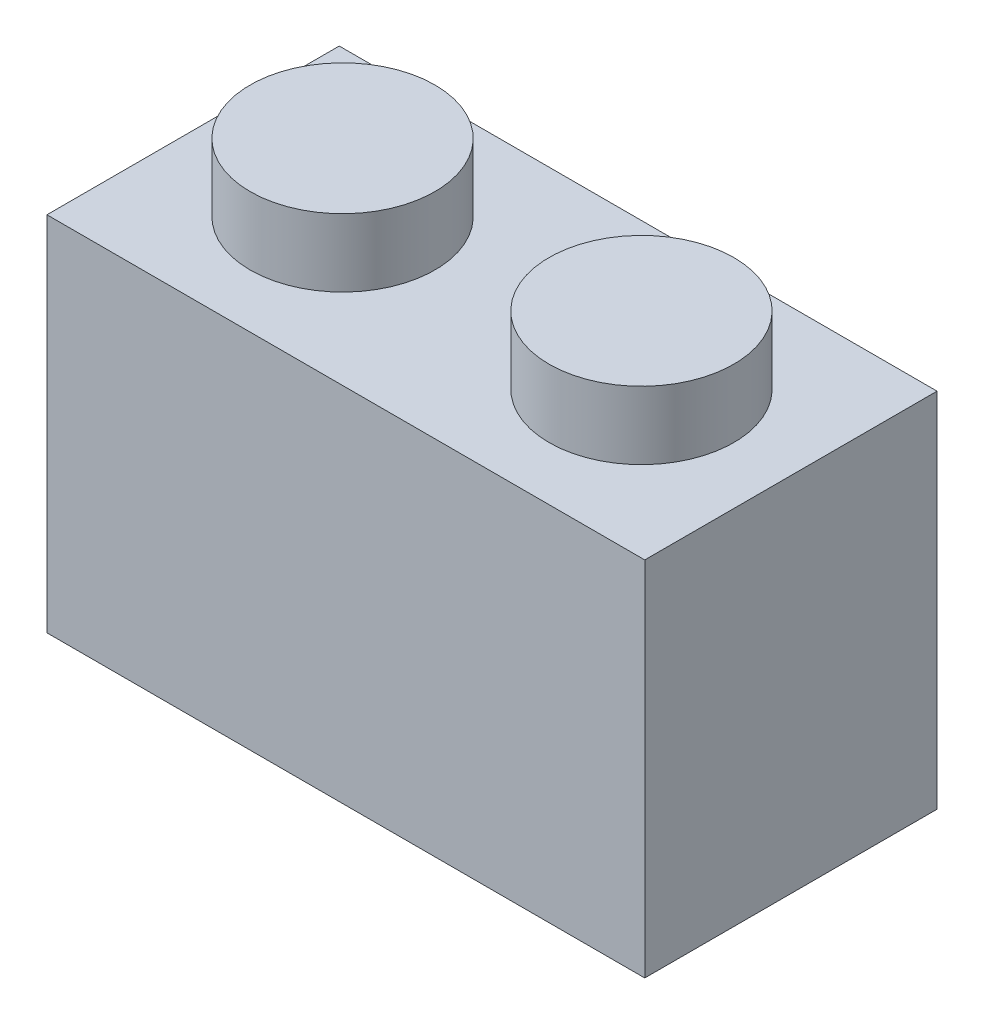
ISO-10303-21;
HEADER;
FILE_DESCRIPTION(('STEP AP214'),'2;1');
FILE_NAME('part.step','',(''),(''),'','','');
FILE_SCHEMA(('AUTOMOTIVE_DESIGN { 1 0 10303 214 1 1 1 1 }'));
ENDSEC;
DATA;
#1=APPLICATION_CONTEXT('core data for automotive mechanical design processes');
#2=APPLICATION_PROTOCOL_DEFINITION('international standard','automotive_design',2000,#1);
#3=PRODUCT_CONTEXT('',#1,'mechanical');
#4=PRODUCT('Part','Part','',(#3));
#5=PRODUCT_RELATED_PRODUCT_CATEGORY('part','',(#4));
#6=PRODUCT_DEFINITION_FORMATION('','',#4);
#7=PRODUCT_DEFINITION_CONTEXT('part definition',#1,'design');
#8=PRODUCT_DEFINITION('design','',#6,#7);
#9=PRODUCT_DEFINITION_SHAPE('','',#8);
#10=(LENGTH_UNIT() NAMED_UNIT(*) SI_UNIT(.MILLI.,.METRE.));
#11=(NAMED_UNIT(*) PLANE_ANGLE_UNIT() SI_UNIT($,.RADIAN.));
#12=(NAMED_UNIT(*) SI_UNIT($,.STERADIAN.) SOLID_ANGLE_UNIT());
#13=UNCERTAINTY_MEASURE_WITH_UNIT(LENGTH_MEASURE(1.E-05),#10,'distance_accuracy_value','');
#14=(GEOMETRIC_REPRESENTATION_CONTEXT(3) GLOBAL_UNCERTAINTY_ASSIGNED_CONTEXT((#13)) GLOBAL_UNIT_ASSIGNED_CONTEXT((#10,
#11,#12)) REPRESENTATION_CONTEXT('',''));
#15=CARTESIAN_POINT('',(0.,0.,0.));
#16=DIRECTION('',(0.,0.,1.));
#17=DIRECTION('',(1.,0.,0.));
#18=AXIS2_PLACEMENT_3D('',#15,#16,#17);
#19=CARTESIAN_POINT('',(7.925,-9.6,-3.875));
#20=DIRECTION('',(1.,0.,0.));
#21=DIRECTION('',(0.,0.,-1.));
#22=AXIS2_PLACEMENT_3D('',#19,#20,#21);
#23=PLANE('',#22);
#24=DIRECTION('',(0.,0.,-1.));
#25=VECTOR('',#24,1.);
#26=CARTESIAN_POINT('',(7.925,0.,-3.875));
#27=LINE('',#26,#25);
#28=CARTESIAN_POINT('',(7.925,0.,3.875));
#29=VERTEX_POINT('',#28);
#30=CARTESIAN_POINT('',(7.925,0.,-3.875));
#31=VERTEX_POINT('',#30);
#32=EDGE_CURVE('E166',#29,#31,#27,.T.);
#33=ORIENTED_EDGE('',*,*,#32,.F.);
#34=DIRECTION('',(0.,1.,0.));
#35=VECTOR('',#34,1.);
#36=CARTESIAN_POINT('',(7.925,-9.6,3.875));
#37=LINE('',#36,#35);
#38=CARTESIAN_POINT('',(7.925,-9.6,3.875));
#39=VERTEX_POINT('',#38);
#40=EDGE_CURVE('E11',#39,#29,#37,.T.);
#41=ORIENTED_EDGE('',*,*,#40,.F.);
#42=DIRECTION('',(0.,0.,-1.));
#43=VECTOR('',#42,1.);
#44=CARTESIAN_POINT('',(7.925,-9.6,-3.875));
#45=LINE('',#44,#43);
#46=CARTESIAN_POINT('',(7.925,-9.6,-3.875));
#47=VERTEX_POINT('',#46);
#48=EDGE_CURVE('E169',#39,#47,#45,.T.);
#49=ORIENTED_EDGE('',*,*,#48,.T.);
#50=DIRECTION('',(0.,1.,0.));
#51=VECTOR('',#50,1.);
#52=CARTESIAN_POINT('',(7.925,-9.6,-3.875));
#53=LINE('',#52,#51);
#54=EDGE_CURVE('E35',#47,#31,#53,.T.);
#55=ORIENTED_EDGE('',*,*,#54,.T.);
#56=EDGE_LOOP('',(#33,#41,#49,#55));
#57=FACE_BOUND('',#56,.T.);
#58=ADVANCED_FACE('F32',(#57),#23,.T.);
#59=CARTESIAN_POINT('',(-7.925,-9.6,3.875));
#60=DIRECTION('',(0.,0.,1.));
#61=DIRECTION('',(1.,0.,0.));
#62=AXIS2_PLACEMENT_3D('',#59,#60,#61);
#63=PLANE('',#62);
#64=DIRECTION('',(1.,0.,0.));
#65=VECTOR('',#64,1.);
#66=CARTESIAN_POINT('',(-7.925,0.,3.875));
#67=LINE('',#66,#65);
#68=CARTESIAN_POINT('',(-7.925,0.,3.875));
#69=VERTEX_POINT('',#68);
#70=EDGE_CURVE('E172',#69,#29,#67,.T.);
#71=ORIENTED_EDGE('',*,*,#70,.F.);
#72=DIRECTION('',(0.,1.,0.));
#73=VECTOR('',#72,1.);
#74=CARTESIAN_POINT('',(-7.925,-9.6,3.875));
#75=LINE('',#74,#73);
#76=CARTESIAN_POINT('',(-7.925,-9.6,3.875));
#77=VERTEX_POINT('',#76);
#78=EDGE_CURVE('E40',#77,#69,#75,.T.);
#79=ORIENTED_EDGE('',*,*,#78,.F.);
#80=DIRECTION('',(1.,0.,0.));
#81=VECTOR('',#80,1.);
#82=CARTESIAN_POINT('',(-7.925,-9.6,3.875));
#83=LINE('',#82,#81);
#84=EDGE_CURVE('E177',#77,#39,#83,.T.);
#85=ORIENTED_EDGE('',*,*,#84,.T.);
#86=ORIENTED_EDGE('',*,*,#40,.T.);
#87=EDGE_LOOP('',(#71,#79,#85,#86));
#88=FACE_BOUND('',#87,.T.);
#89=ADVANCED_FACE('F194',(#88),#63,.T.);
#90=CARTESIAN_POINT('',(-7.925,-9.6,-3.875));
#91=DIRECTION('',(-1.,0.,0.));
#92=DIRECTION('',(0.,0.,1.));
#93=AXIS2_PLACEMENT_3D('',#90,#91,#92);
#94=PLANE('',#93);
#95=DIRECTION('',(0.,0.,1.));
#96=VECTOR('',#95,1.);
#97=CARTESIAN_POINT('',(-7.925,0.,-3.875));
#98=LINE('',#97,#96);
#99=CARTESIAN_POINT('',(-7.925,0.,-3.875));
#100=VERTEX_POINT('',#99);
#101=EDGE_CURVE('E184',#100,#69,#98,.T.);
#102=ORIENTED_EDGE('',*,*,#101,.F.);
#103=DIRECTION('',(0.,1.,0.));
#104=VECTOR('',#103,1.);
#105=CARTESIAN_POINT('',(-7.925,-9.6,-3.875));
#106=LINE('',#105,#104);
#107=CARTESIAN_POINT('',(-7.925,-9.6,-3.875));
#108=VERTEX_POINT('',#107);
#109=EDGE_CURVE('E189',#108,#100,#106,.T.);
#110=ORIENTED_EDGE('',*,*,#109,.F.);
#111=DIRECTION('',(0.,0.,1.));
#112=VECTOR('',#111,1.);
#113=CARTESIAN_POINT('',(-7.925,-9.6,-3.875));
#114=LINE('',#113,#112);
#115=EDGE_CURVE('E174',#108,#77,#114,.T.);
#116=ORIENTED_EDGE('',*,*,#115,.T.);
#117=ORIENTED_EDGE('',*,*,#78,.T.);
#118=EDGE_LOOP('',(#102,#110,#116,#117));
#119=FACE_BOUND('',#118,.T.);
#120=ADVANCED_FACE('F198',(#119),#94,.T.);
#121=CARTESIAN_POINT('',(-7.925,-9.6,-3.875));
#122=DIRECTION('',(0.,0.,-1.));
#123=DIRECTION('',(-1.,0.,0.));
#124=AXIS2_PLACEMENT_3D('',#121,#122,#123);
#125=PLANE('',#124);
#126=DIRECTION('',(-1.,0.,0.));
#127=VECTOR('',#126,1.);
#128=CARTESIAN_POINT('',(-7.925,0.,-3.875));
#129=LINE('',#128,#127);
#130=EDGE_CURVE('E181',#31,#100,#129,.T.);
#131=ORIENTED_EDGE('',*,*,#130,.F.);
#132=ORIENTED_EDGE('',*,*,#54,.F.);
#133=DIRECTION('',(-1.,0.,0.));
#134=VECTOR('',#133,1.);
#135=CARTESIAN_POINT('',(-7.925,-9.6,-3.875));
#136=LINE('',#135,#134);
#137=EDGE_CURVE('E171',#47,#108,#136,.T.);
#138=ORIENTED_EDGE('',*,*,#137,.T.);
#139=ORIENTED_EDGE('',*,*,#109,.T.);
#140=EDGE_LOOP('',(#131,#132,#138,#139));
#141=FACE_BOUND('',#140,.T.);
#142=ADVANCED_FACE('F191',(#141),#125,.T.);
#143=CARTESIAN_POINT('',(0.,-9.6,0.));
#144=DIRECTION('',(0.,1.,0.));
#145=DIRECTION('',(0.,0.,1.));
#146=AXIS2_PLACEMENT_3D('',#143,#144,#145);
#147=PLANE('',#146);
#148=DIRECTION('',(1.,0.,0.));
#149=VECTOR('',#148,1.);
#150=CARTESIAN_POINT('',(0.,-9.6,2.375));
#151=LINE('',#150,#149);
#152=CARTESIAN_POINT('',(-6.425,-9.6,2.375));
#153=VERTEX_POINT('',#152);
#154=CARTESIAN_POINT('',(6.425,-9.6,2.375));
#155=VERTEX_POINT('',#154);
#156=EDGE_CURVE('E152',#153,#155,#151,.T.);
#157=ORIENTED_EDGE('',*,*,#156,.T.);
#158=DIRECTION('',(0.,0.,-1.));
#159=VECTOR('',#158,1.);
#160=CARTESIAN_POINT('',(6.425,-9.6,0.));
#161=LINE('',#160,#159);
#162=CARTESIAN_POINT('',(6.425,-9.6,-2.375));
#163=VERTEX_POINT('',#162);
#164=EDGE_CURVE('E109',#155,#163,#161,.T.);
#165=ORIENTED_EDGE('',*,*,#164,.T.);
#166=DIRECTION('',(-1.,0.,0.));
#167=VECTOR('',#166,1.);
#168=CARTESIAN_POINT('',(0.,-9.6,-2.375));
#169=LINE('',#168,#167);
#170=CARTESIAN_POINT('',(-6.425,-9.6,-2.375));
#171=VERTEX_POINT('',#170);
#172=EDGE_CURVE('E131',#163,#171,#169,.T.);
#173=ORIENTED_EDGE('',*,*,#172,.T.);
#174=DIRECTION('',(0.,0.,1.));
#175=VECTOR('',#174,1.);
#176=CARTESIAN_POINT('',(-6.425,-9.6,0.));
#177=LINE('',#176,#175);
#178=EDGE_CURVE('E48',#171,#153,#177,.T.);
#179=ORIENTED_EDGE('',*,*,#178,.T.);
#180=EDGE_LOOP('',(#157,#165,#173,#179));
#181=FACE_BOUND('',#180,.T.);
#182=ORIENTED_EDGE('',*,*,#48,.F.);
#183=ORIENTED_EDGE('',*,*,#84,.F.);
#184=ORIENTED_EDGE('',*,*,#115,.F.);
#185=ORIENTED_EDGE('',*,*,#137,.F.);
#186=EDGE_LOOP('',(#182,#183,#184,#185));
#187=FACE_BOUND('',#186,.T.);
#188=ADVANCED_FACE('F200',(#181,#187),#147,.F.);
#189=CARTESIAN_POINT('',(0.,0.,0.));
#190=DIRECTION('',(0.,1.,0.));
#191=DIRECTION('',(0.,0.,1.));
#192=AXIS2_PLACEMENT_3D('',#189,#190,#191);
#193=PLANE('',#192);
#194=CARTESIAN_POINT('',(3.9625,0.,0.));
#195=DIRECTION('',(0.,1.,0.));
#196=DIRECTION('',(0.,0.,-1.));
#197=AXIS2_PLACEMENT_3D('',#194,#195,#196);
#198=CIRCLE('',#197,2.45);
#199=CARTESIAN_POINT('',(3.9625,0.,-2.45));
#200=VERTEX_POINT('',#199);
#201=EDGE_CURVE('E114',#200,#200,#198,.T.);
#202=ORIENTED_EDGE('',*,*,#201,.F.);
#203=EDGE_LOOP('',(#202));
#204=FACE_BOUND('',#203,.T.);
#205=CARTESIAN_POINT('',(-3.9625,0.,0.));
#206=DIRECTION('',(0.,1.,0.));
#207=DIRECTION('',(0.,0.,1.));
#208=AXIS2_PLACEMENT_3D('',#205,#206,#207);
#209=CIRCLE('',#208,2.45);
#210=CARTESIAN_POINT('',(-3.9625,0.,2.45));
#211=VERTEX_POINT('',#210);
#212=EDGE_CURVE('E160',#211,#211,#209,.T.);
#213=ORIENTED_EDGE('',*,*,#212,.F.);
#214=EDGE_LOOP('',(#213));
#215=FACE_BOUND('',#214,.T.);
#216=ORIENTED_EDGE('',*,*,#32,.T.);
#217=ORIENTED_EDGE('',*,*,#130,.T.);
#218=ORIENTED_EDGE('',*,*,#101,.T.);
#219=ORIENTED_EDGE('',*,*,#70,.T.);
#220=EDGE_LOOP('',(#216,#217,#218,#219));
#221=FACE_BOUND('',#220,.T.);
#222=ADVANCED_FACE('F193',(#204,#215,#221),#193,.T.);
#223=CARTESIAN_POINT('',(-3.9625,1.8,0.));
#224=DIRECTION('',(0.,-1.,0.));
#225=DIRECTION('',(0.,0.,-1.));
#226=AXIS2_PLACEMENT_3D('',#223,#224,#225);
#227=CYLINDRICAL_SURFACE('',#226,2.45);
#228=CARTESIAN_POINT('',(-3.9625,1.8,0.));
#229=DIRECTION('',(0.,1.,0.));
#230=DIRECTION('',(0.,0.,1.));
#231=AXIS2_PLACEMENT_3D('',#228,#229,#230);
#232=CIRCLE('',#231,2.45);
#233=CARTESIAN_POINT('',(-3.9625,1.8,2.45));
#234=VERTEX_POINT('',#233);
#235=EDGE_CURVE('E163',#234,#234,#232,.T.);
#236=ORIENTED_EDGE('',*,*,#235,.F.);
#237=EDGE_LOOP('',(#236));
#238=FACE_BOUND('',#237,.T.);
#239=ORIENTED_EDGE('',*,*,#212,.T.);
#240=EDGE_LOOP('',(#239));
#241=FACE_BOUND('',#240,.T.);
#242=ADVANCED_FACE('F208',(#238,#241),#227,.T.);
#243=CARTESIAN_POINT('',(-3.9625,1.8,0.));
#244=DIRECTION('',(0.,1.,0.));
#245=DIRECTION('',(0.,0.,1.));
#246=AXIS2_PLACEMENT_3D('',#243,#244,#245);
#247=PLANE('',#246);
#248=ORIENTED_EDGE('',*,*,#235,.T.);
#249=EDGE_LOOP('',(#248));
#250=FACE_BOUND('',#249,.T.);
#251=ADVANCED_FACE('F243',(#250),#247,.T.);
#252=CARTESIAN_POINT('',(3.9625,1.8,0.));
#253=DIRECTION('',(0.,-1.,0.));
#254=DIRECTION('',(0.,0.,-1.));
#255=AXIS2_PLACEMENT_3D('',#252,#253,#254);
#256=CYLINDRICAL_SURFACE('',#255,2.45);
#257=CARTESIAN_POINT('',(3.9625,1.8,0.));
#258=DIRECTION('',(0.,1.,0.));
#259=DIRECTION('',(0.,0.,-1.));
#260=AXIS2_PLACEMENT_3D('',#257,#258,#259);
#261=CIRCLE('',#260,2.45);
#262=CARTESIAN_POINT('',(3.9625,1.8,-2.45));
#263=VERTEX_POINT('',#262);
#264=EDGE_CURVE('E157',#263,#263,#261,.T.);
#265=ORIENTED_EDGE('',*,*,#264,.F.);
#266=EDGE_LOOP('',(#265));
#267=FACE_BOUND('',#266,.T.);
#268=ORIENTED_EDGE('',*,*,#201,.T.);
#269=EDGE_LOOP('',(#268));
#270=FACE_BOUND('',#269,.T.);
#271=ADVANCED_FACE('F252',(#267,#270),#256,.T.);
#272=CARTESIAN_POINT('',(3.9625,1.8,0.));
#273=DIRECTION('',(0.,-1.,0.));
#274=DIRECTION('',(0.,0.,-1.));
#275=AXIS2_PLACEMENT_3D('',#272,#273,#274);
#276=PLANE('',#275);
#277=ORIENTED_EDGE('',*,*,#264,.T.);
#278=EDGE_LOOP('',(#277));
#279=FACE_BOUND('',#278,.T.);
#280=ADVANCED_FACE('F262',(#279),#276,.F.);
#281=CARTESIAN_POINT('',(6.425,-9.6,-3.875));
#282=DIRECTION('',(1.,0.,0.));
#283=DIRECTION('',(0.,0.,-1.));
#284=AXIS2_PLACEMENT_3D('',#281,#282,#283);
#285=PLANE('',#284);
#286=DIRECTION('',(0.,0.,-1.));
#287=VECTOR('',#286,1.);
#288=CARTESIAN_POINT('',(6.425,-1.5,0.));
#289=LINE('',#288,#287);
#290=CARTESIAN_POINT('',(6.425,-1.5,2.375));
#291=VERTEX_POINT('',#290);
#292=CARTESIAN_POINT('',(6.425,-1.5,-2.375));
#293=VERTEX_POINT('',#292);
#294=EDGE_CURVE('E107',#291,#293,#289,.T.);
#295=ORIENTED_EDGE('',*,*,#294,.T.);
#296=DIRECTION('',(0.,1.,0.));
#297=VECTOR('',#296,1.);
#298=CARTESIAN_POINT('',(6.425,-9.6,-2.375));
#299=LINE('',#298,#297);
#300=EDGE_CURVE('E136',#163,#293,#299,.T.);
#301=ORIENTED_EDGE('',*,*,#300,.F.);
#302=ORIENTED_EDGE('',*,*,#164,.F.);
#303=DIRECTION('',(0.,1.,0.));
#304=VECTOR('',#303,1.);
#305=CARTESIAN_POINT('',(6.425,-9.6,2.375));
#306=LINE('',#305,#304);
#307=EDGE_CURVE('E104',#155,#291,#306,.T.);
#308=ORIENTED_EDGE('',*,*,#307,.T.);
#309=EDGE_LOOP('',(#295,#301,#302,#308));
#310=FACE_BOUND('',#309,.T.);
#311=ADVANCED_FACE('F106',(#310),#285,.F.);
#312=CARTESIAN_POINT('',(-7.925,-9.6,2.375));
#313=DIRECTION('',(0.,0.,1.));
#314=DIRECTION('',(1.,0.,0.));
#315=AXIS2_PLACEMENT_3D('',#312,#313,#314);
#316=PLANE('',#315);
#317=DIRECTION('',(1.,0.,0.));
#318=VECTOR('',#317,1.);
#319=CARTESIAN_POINT('',(0.,-1.5,2.375));
#320=LINE('',#319,#318);
#321=CARTESIAN_POINT('',(-6.425,-1.5,2.375));
#322=VERTEX_POINT('',#321);
#323=EDGE_CURVE('E122',#322,#291,#320,.T.);
#324=ORIENTED_EDGE('',*,*,#323,.T.);
#325=ORIENTED_EDGE('',*,*,#307,.F.);
#326=ORIENTED_EDGE('',*,*,#156,.F.);
#327=DIRECTION('',(0.,1.,0.));
#328=VECTOR('',#327,1.);
#329=CARTESIAN_POINT('',(-6.425,-9.6,2.375));
#330=LINE('',#329,#328);
#331=EDGE_CURVE('E115',#153,#322,#330,.T.);
#332=ORIENTED_EDGE('',*,*,#331,.T.);
#333=EDGE_LOOP('',(#324,#325,#326,#332));
#334=FACE_BOUND('',#333,.T.);
#335=ADVANCED_FACE('F127',(#334),#316,.F.);
#336=CARTESIAN_POINT('',(-6.425,-9.6,-3.875));
#337=DIRECTION('',(-1.,0.,0.));
#338=DIRECTION('',(0.,0.,1.));
#339=AXIS2_PLACEMENT_3D('',#336,#337,#338);
#340=PLANE('',#339);
#341=DIRECTION('',(0.,0.,1.));
#342=VECTOR('',#341,1.);
#343=CARTESIAN_POINT('',(-6.425,-1.5,0.));
#344=LINE('',#343,#342);
#345=CARTESIAN_POINT('',(-6.425,-1.5,-2.375));
#346=VERTEX_POINT('',#345);
#347=EDGE_CURVE('E129',#346,#322,#344,.T.);
#348=ORIENTED_EDGE('',*,*,#347,.T.);
#349=ORIENTED_EDGE('',*,*,#331,.F.);
#350=ORIENTED_EDGE('',*,*,#178,.F.);
#351=DIRECTION('',(0.,1.,0.));
#352=VECTOR('',#351,1.);
#353=CARTESIAN_POINT('',(-6.425,-9.6,-2.375));
#354=LINE('',#353,#352);
#355=EDGE_CURVE('E137',#171,#346,#354,.T.);
#356=ORIENTED_EDGE('',*,*,#355,.T.);
#357=EDGE_LOOP('',(#348,#349,#350,#356));
#358=FACE_BOUND('',#357,.T.);
#359=ADVANCED_FACE('F292',(#358),#340,.F.);
#360=CARTESIAN_POINT('',(-7.925,-9.6,-2.375));
#361=DIRECTION('',(0.,0.,-1.));
#362=DIRECTION('',(-1.,0.,0.));
#363=AXIS2_PLACEMENT_3D('',#360,#361,#362);
#364=PLANE('',#363);
#365=DIRECTION('',(-1.,0.,0.));
#366=VECTOR('',#365,1.);
#367=CARTESIAN_POINT('',(0.,-1.5,-2.375));
#368=LINE('',#367,#366);
#369=EDGE_CURVE('E124',#293,#346,#368,.T.);
#370=ORIENTED_EDGE('',*,*,#369,.T.);
#371=ORIENTED_EDGE('',*,*,#355,.F.);
#372=ORIENTED_EDGE('',*,*,#172,.F.);
#373=ORIENTED_EDGE('',*,*,#300,.T.);
#374=EDGE_LOOP('',(#370,#371,#372,#373));
#375=FACE_BOUND('',#374,.T.);
#376=ADVANCED_FACE('F301',(#375),#364,.F.);
#377=CARTESIAN_POINT('',(0.,-1.5,0.));
#378=DIRECTION('',(0.,1.,0.));
#379=DIRECTION('',(0.,0.,1.));
#380=AXIS2_PLACEMENT_3D('',#377,#378,#379);
#381=PLANE('',#380);
#382=CARTESIAN_POINT('',(3.9625,-1.5,0.));
#383=DIRECTION('',(0.,1.,0.));
#384=DIRECTION('',(0.,0.,1.));
#385=AXIS2_PLACEMENT_3D('',#382,#383,#384);
#386=CIRCLE('',#385,0.950000000000001);
#387=CARTESIAN_POINT('',(3.9625,-1.5,0.950000000000001));
#388=VERTEX_POINT('',#387);
#389=EDGE_CURVE('E141',#388,#388,#386,.T.);
#390=ORIENTED_EDGE('',*,*,#389,.T.);
#391=EDGE_LOOP('',(#390));
#392=FACE_BOUND('',#391,.T.);
#393=CARTESIAN_POINT('',(-3.9625,-1.5,0.));
#394=DIRECTION('',(0.,1.,0.));
#395=DIRECTION('',(0.,0.,1.));
#396=AXIS2_PLACEMENT_3D('',#393,#394,#395);
#397=CIRCLE('',#396,0.950000000000001);
#398=CARTESIAN_POINT('',(-3.9625,-1.5,0.950000000000001));
#399=VERTEX_POINT('',#398);
#400=EDGE_CURVE('E145',#399,#399,#397,.T.);
#401=ORIENTED_EDGE('',*,*,#400,.T.);
#402=EDGE_LOOP('',(#401));
#403=FACE_BOUND('',#402,.T.);
#404=ORIENTED_EDGE('',*,*,#294,.F.);
#405=ORIENTED_EDGE('',*,*,#323,.F.);
#406=ORIENTED_EDGE('',*,*,#347,.F.);
#407=ORIENTED_EDGE('',*,*,#369,.F.);
#408=EDGE_LOOP('',(#404,#405,#406,#407));
#409=FACE_BOUND('',#408,.T.);
#410=ADVANCED_FACE('F120',(#392,#403,#409),#381,.F.);
#411=CARTESIAN_POINT('',(-3.9625,1.8,0.));
#412=DIRECTION('',(0.,-1.,0.));
#413=DIRECTION('',(0.,0.,-1.));
#414=AXIS2_PLACEMENT_3D('',#411,#412,#413);
#415=CYLINDRICAL_SURFACE('',#414,0.950000000000001);
#416=CARTESIAN_POINT('',(-3.9625,0.3,0.));
#417=DIRECTION('',(0.,1.,0.));
#418=DIRECTION('',(0.,0.,1.));
#419=AXIS2_PLACEMENT_3D('',#416,#417,#418);
#420=CIRCLE('',#419,0.950000000000001);
#421=CARTESIAN_POINT('',(-3.9625,0.3,0.950000000000001));
#422=VERTEX_POINT('',#421);
#423=EDGE_CURVE('E125',#422,#422,#420,.T.);
#424=ORIENTED_EDGE('',*,*,#423,.T.);
#425=EDGE_LOOP('',(#424));
#426=FACE_BOUND('',#425,.T.);
#427=ORIENTED_EDGE('',*,*,#400,.F.);
#428=EDGE_LOOP('',(#427));
#429=FACE_BOUND('',#428,.T.);
#430=ADVANCED_FACE('F319',(#426,#429),#415,.F.);
#431=CARTESIAN_POINT('',(-3.9625,0.3,0.));
#432=DIRECTION('',(0.,1.,0.));
#433=DIRECTION('',(0.,0.,1.));
#434=AXIS2_PLACEMENT_3D('',#431,#432,#433);
#435=PLANE('',#434);
#436=ORIENTED_EDGE('',*,*,#423,.F.);
#437=EDGE_LOOP('',(#436));
#438=FACE_BOUND('',#437,.T.);
#439=ADVANCED_FACE('F329',(#438),#435,.F.);
#440=CARTESIAN_POINT('',(3.9625,1.8,0.));
#441=DIRECTION('',(0.,-1.,0.));
#442=DIRECTION('',(0.,0.,-1.));
#443=AXIS2_PLACEMENT_3D('',#440,#441,#442);
#444=CYLINDRICAL_SURFACE('',#443,0.950000000000001);
#445=CARTESIAN_POINT('',(3.9625,0.3,0.));
#446=DIRECTION('',(0.,-1.,0.));
#447=DIRECTION('',(0.,0.,-1.));
#448=AXIS2_PLACEMENT_3D('',#445,#446,#447);
#449=CIRCLE('',#448,0.950000000000001);
#450=CARTESIAN_POINT('',(3.9625,0.3,-0.950000000000001));
#451=VERTEX_POINT('',#450);
#452=EDGE_CURVE('E144',#451,#451,#449,.F.);
#453=ORIENTED_EDGE('',*,*,#452,.T.);
#454=EDGE_LOOP('',(#453));
#455=FACE_BOUND('',#454,.T.);
#456=ORIENTED_EDGE('',*,*,#389,.F.);
#457=EDGE_LOOP('',(#456));
#458=FACE_BOUND('',#457,.T.);
#459=ADVANCED_FACE('F339',(#455,#458),#444,.F.);
#460=CARTESIAN_POINT('',(3.9625,0.3,0.));
#461=DIRECTION('',(0.,-1.,0.));
#462=DIRECTION('',(0.,0.,-1.));
#463=AXIS2_PLACEMENT_3D('',#460,#461,#462);
#464=PLANE('',#463);
#465=ORIENTED_EDGE('',*,*,#452,.F.);
#466=EDGE_LOOP('',(#465));
#467=FACE_BOUND('',#466,.T.);
#468=ADVANCED_FACE('F349',(#467),#464,.T.);
#469=CLOSED_SHELL('',(#58,#89,#120,#142,#188,#222,#242,#251,#271,#280,#311,#335,#359,#376,#410,
#430,#439,#459,#468));
#470=MANIFOLD_SOLID_BREP('B2',#469);
#471=ADVANCED_BREP_SHAPE_REPRESENTATION('',(#18,#470),#14);
#472=SHAPE_DEFINITION_REPRESENTATION(#9,#471);
ENDSEC;
END-ISO-10303-21;
